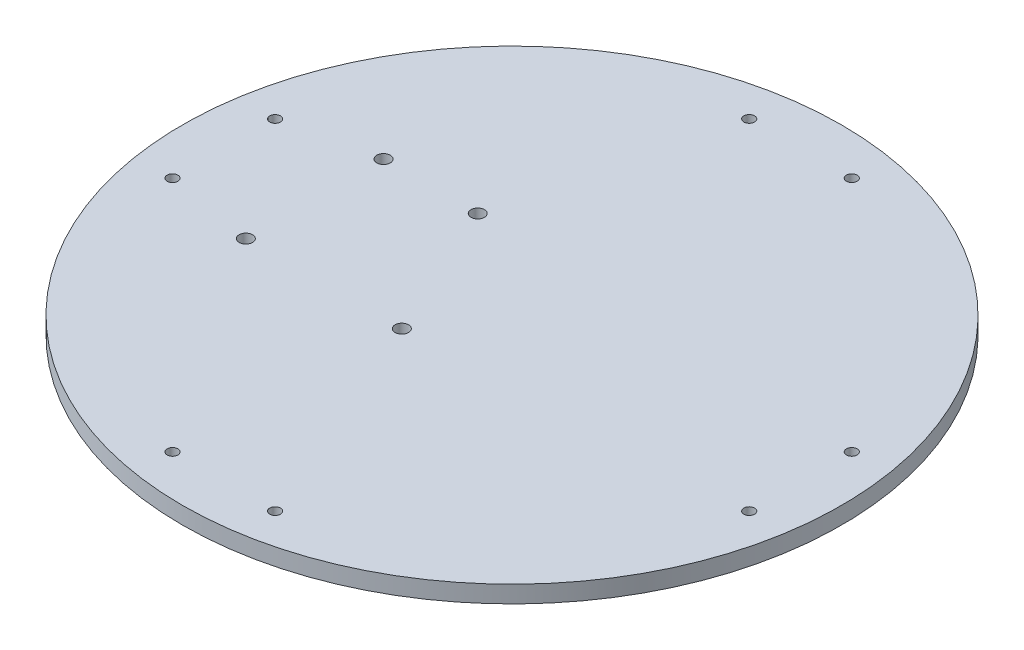
ISO-10303-21;
HEADER;
FILE_DESCRIPTION(('STEP AP214'),'2;1');
FILE_NAME('part.step','',(''),(''),'','','');
FILE_SCHEMA(('AUTOMOTIVE_DESIGN { 1 0 10303 214 1 1 1 1 }'));
ENDSEC;
DATA;
#1=APPLICATION_CONTEXT('core data for automotive mechanical design processes');
#2=APPLICATION_PROTOCOL_DEFINITION('international standard','automotive_design',2000,#1);
#3=PRODUCT_CONTEXT('',#1,'mechanical');
#4=PRODUCT('Part','Part','',(#3));
#5=PRODUCT_RELATED_PRODUCT_CATEGORY('part','',(#4));
#6=PRODUCT_DEFINITION_FORMATION('','',#4);
#7=PRODUCT_DEFINITION_CONTEXT('part definition',#1,'design');
#8=PRODUCT_DEFINITION('design','',#6,#7);
#9=PRODUCT_DEFINITION_SHAPE('','',#8);
#10=(LENGTH_UNIT() NAMED_UNIT(*) SI_UNIT(.MILLI.,.METRE.));
#11=(NAMED_UNIT(*) PLANE_ANGLE_UNIT() SI_UNIT($,.RADIAN.));
#12=(NAMED_UNIT(*) SI_UNIT($,.STERADIAN.) SOLID_ANGLE_UNIT());
#13=UNCERTAINTY_MEASURE_WITH_UNIT(LENGTH_MEASURE(1.E-05),#10,'distance_accuracy_value','');
#14=(GEOMETRIC_REPRESENTATION_CONTEXT(3) GLOBAL_UNCERTAINTY_ASSIGNED_CONTEXT((#13)) GLOBAL_UNIT_ASSIGNED_CONTEXT((#10,
#11,#12)) REPRESENTATION_CONTEXT('',''));
#15=CARTESIAN_POINT('',(0.,0.,0.));
#16=DIRECTION('',(0.,0.,1.));
#17=DIRECTION('',(1.,0.,0.));
#18=AXIS2_PLACEMENT_3D('',#15,#16,#17);
#19=CARTESIAN_POINT('',(0.,6.35,0.));
#20=DIRECTION('',(0.,-1.,0.));
#21=DIRECTION('',(0.,0.,-1.));
#22=AXIS2_PLACEMENT_3D('',#19,#20,#21);
#23=CYLINDRICAL_SURFACE('',#22,122.4);
#24=CARTESIAN_POINT('',(0.,6.35,0.));
#25=DIRECTION('',(0.,1.,0.));
#26=DIRECTION('',(0.,0.,1.));
#27=AXIS2_PLACEMENT_3D('',#24,#25,#26);
#28=CIRCLE('',#27,122.4);
#29=CARTESIAN_POINT('',(0.,6.35,122.4));
#30=VERTEX_POINT('',#29);
#31=EDGE_CURVE('E10',#30,#30,#28,.T.);
#32=ORIENTED_EDGE('',*,*,#31,.F.);
#33=EDGE_LOOP('',(#32));
#34=FACE_BOUND('',#33,.T.);
#35=CARTESIAN_POINT('',(0.,0.,0.));
#36=DIRECTION('',(0.,1.,0.));
#37=DIRECTION('',(0.,0.,1.));
#38=AXIS2_PLACEMENT_3D('',#35,#36,#37);
#39=CIRCLE('',#38,122.4);
#40=CARTESIAN_POINT('',(0.,0.,122.4));
#41=VERTEX_POINT('',#40);
#42=EDGE_CURVE('E34',#41,#41,#39,.T.);
#43=ORIENTED_EDGE('',*,*,#42,.T.);
#44=EDGE_LOOP('',(#43));
#45=FACE_BOUND('',#44,.T.);
#46=ADVANCED_FACE('F31',(#34,#45),#23,.T.);
#47=CARTESIAN_POINT('',(0.,6.35,0.));
#48=DIRECTION('',(0.,1.,0.));
#49=DIRECTION('',(0.,0.,1.));
#50=AXIS2_PLACEMENT_3D('',#47,#48,#49);
#51=PLANE('',#50);
#52=CARTESIAN_POINT('',(-74.0546317465637,6.35,24.8087490188917));
#53=DIRECTION('',(0.,1.,0.));
#54=DIRECTION('',(0.,0.,1.));
#55=AXIS2_PLACEMENT_3D('',#52,#53,#54);
#56=CIRCLE('',#55,2.5);
#57=CARTESIAN_POINT('',(-74.0546317465637,6.35,27.3087490188917));
#58=VERTEX_POINT('',#57);
#59=EDGE_CURVE('E97',#58,#58,#56,.T.);
#60=ORIENTED_EDGE('',*,*,#59,.F.);
#61=EDGE_LOOP('',(#60));
#62=FACE_BOUND('',#61,.T.);
#63=CARTESIAN_POINT('',(-16.1134368858091,6.35,24.8087490188917));
#64=DIRECTION('',(0.,1.,0.));
#65=DIRECTION('',(0.,0.,1.));
#66=AXIS2_PLACEMENT_3D('',#63,#64,#65);
#67=CIRCLE('',#66,2.5);
#68=CARTESIAN_POINT('',(-16.1134368858091,6.35,27.3087490188917));
#69=VERTEX_POINT('',#68);
#70=EDGE_CURVE('E103',#69,#69,#67,.T.);
#71=ORIENTED_EDGE('',*,*,#70,.F.);
#72=EDGE_LOOP('',(#71));
#73=FACE_BOUND('',#72,.T.);
#74=CARTESIAN_POINT('',(-39.0546317465637,6.35,-26.3358164106052));
#75=DIRECTION('',(0.,1.,0.));
#76=DIRECTION('',(0.,0.,1.));
#77=AXIS2_PLACEMENT_3D('',#74,#75,#76);
#78=CIRCLE('',#77,2.5);
#79=CARTESIAN_POINT('',(-39.0546317465637,6.35,-23.8358164106052));
#80=VERTEX_POINT('',#79);
#81=EDGE_CURVE('E109',#80,#80,#78,.T.);
#82=ORIENTED_EDGE('',*,*,#81,.F.);
#83=EDGE_LOOP('',(#82));
#84=FACE_BOUND('',#83,.T.);
#85=CARTESIAN_POINT('',(-74.0546317465637,6.35,-26.3358164106052));
#86=DIRECTION('',(0.,1.,0.));
#87=DIRECTION('',(0.,0.,1.));
#88=AXIS2_PLACEMENT_3D('',#85,#86,#87);
#89=CIRCLE('',#88,2.5);
#90=CARTESIAN_POINT('',(-74.0546317465637,6.35,-23.8358164106052));
#91=VERTEX_POINT('',#90);
#92=EDGE_CURVE('E91',#91,#91,#89,.T.);
#93=ORIENTED_EDGE('',*,*,#92,.F.);
#94=EDGE_LOOP('',(#93));
#95=FACE_BOUND('',#94,.T.);
#96=CARTESIAN_POINT('',(-107.09237909833,6.35,18.9931628263646));
#97=DIRECTION('',(0.,1.,0.));
#98=DIRECTION('',(-1.,0.,0.));
#99=AXIS2_PLACEMENT_3D('',#96,#97,#98);
#100=CIRCLE('',#99,1.99389999999999);
#101=CARTESIAN_POINT('',(-109.08627909833,6.35,18.9931628263646));
#102=VERTEX_POINT('',#101);
#103=EDGE_CURVE('E61',#102,#102,#100,.T.);
#104=ORIENTED_EDGE('',*,*,#103,.F.);
#105=EDGE_LOOP('',(#104));
#106=FACE_BOUND('',#105,.T.);
#107=CARTESIAN_POINT('',(-107.09237909833,6.35,-19.1068371736354));
#108=DIRECTION('',(0.,1.,0.));
#109=DIRECTION('',(-1.,0.,0.));
#110=AXIS2_PLACEMENT_3D('',#107,#108,#109);
#111=CIRCLE('',#110,1.99389999999999);
#112=CARTESIAN_POINT('',(-109.08627909833,6.35,-19.1068371736354));
#113=VERTEX_POINT('',#112);
#114=EDGE_CURVE('E68',#113,#113,#111,.T.);
#115=ORIENTED_EDGE('',*,*,#114,.F.);
#116=EDGE_LOOP('',(#115));
#117=FACE_BOUND('',#116,.T.);
#118=CARTESIAN_POINT('',(-19.05,6.35,-107.149216271966));
#119=DIRECTION('',(0.,1.,0.));
#120=DIRECTION('',(0.,0.,-1.));
#121=AXIS2_PLACEMENT_3D('',#118,#119,#120);
#122=CIRCLE('',#121,1.99389999999999);
#123=CARTESIAN_POINT('',(-19.05,6.35,-109.143116271966));
#124=VERTEX_POINT('',#123);
#125=EDGE_CURVE('E74',#124,#124,#122,.T.);
#126=ORIENTED_EDGE('',*,*,#125,.F.);
#127=EDGE_LOOP('',(#126));
#128=FACE_BOUND('',#127,.T.);
#129=CARTESIAN_POINT('',(19.05,6.35,-107.149216271966));
#130=DIRECTION('',(0.,1.,0.));
#131=DIRECTION('',(0.,0.,-1.));
#132=AXIS2_PLACEMENT_3D('',#129,#130,#131);
#133=CIRCLE('',#132,1.99389999999999);
#134=CARTESIAN_POINT('',(19.05,6.35,-109.143116271966));
#135=VERTEX_POINT('',#134);
#136=EDGE_CURVE('E80',#135,#135,#133,.T.);
#137=ORIENTED_EDGE('',*,*,#136,.F.);
#138=EDGE_LOOP('',(#137));
#139=FACE_BOUND('',#138,.T.);
#140=CARTESIAN_POINT('',(107.09237909833,6.35,-19.1068371736369));
#141=DIRECTION('',(0.,1.,0.));
#142=DIRECTION('',(1.,0.,0.));
#143=AXIS2_PLACEMENT_3D('',#140,#141,#142);
#144=CIRCLE('',#143,1.99389999999999);
#145=CARTESIAN_POINT('',(109.08627909833,6.35,-19.1068371736369));
#146=VERTEX_POINT('',#145);
#147=EDGE_CURVE('E86',#146,#146,#144,.T.);
#148=ORIENTED_EDGE('',*,*,#147,.F.);
#149=EDGE_LOOP('',(#148));
#150=FACE_BOUND('',#149,.T.);
#151=CARTESIAN_POINT('',(107.09237909833,6.35,18.9931628263631));
#152=DIRECTION('',(0.,1.,0.));
#153=DIRECTION('',(1.,0.,0.));
#154=AXIS2_PLACEMENT_3D('',#151,#152,#153);
#155=CIRCLE('',#154,1.99389999999999);
#156=CARTESIAN_POINT('',(109.08627909833,6.35,18.9931628263631));
#157=VERTEX_POINT('',#156);
#158=EDGE_CURVE('E55',#157,#157,#155,.T.);
#159=ORIENTED_EDGE('',*,*,#158,.F.);
#160=EDGE_LOOP('',(#159));
#161=FACE_BOUND('',#160,.T.);
#162=CARTESIAN_POINT('',(-19.05,6.35,107.035541924693));
#163=DIRECTION('',(0.,1.,0.));
#164=DIRECTION('',(0.,0.,1.));
#165=AXIS2_PLACEMENT_3D('',#162,#163,#164);
#166=CIRCLE('',#165,1.99389999999999);
#167=CARTESIAN_POINT('',(-19.05,6.35,109.029441924693));
#168=VERTEX_POINT('',#167);
#169=EDGE_CURVE('E50',#168,#168,#166,.T.);
#170=ORIENTED_EDGE('',*,*,#169,.F.);
#171=EDGE_LOOP('',(#170));
#172=FACE_BOUND('',#171,.T.);
#173=CARTESIAN_POINT('',(19.05,6.35,107.035541924693));
#174=DIRECTION('',(0.,1.,0.));
#175=DIRECTION('',(0.,0.,1.));
#176=AXIS2_PLACEMENT_3D('',#173,#174,#175);
#177=CIRCLE('',#176,1.99389999999999);
#178=CARTESIAN_POINT('',(19.05,6.35,109.029441924693));
#179=VERTEX_POINT('',#178);
#180=EDGE_CURVE('E43',#179,#179,#177,.T.);
#181=ORIENTED_EDGE('',*,*,#180,.F.);
#182=EDGE_LOOP('',(#181));
#183=FACE_BOUND('',#182,.T.);
#184=ORIENTED_EDGE('',*,*,#31,.T.);
#185=EDGE_LOOP('',(#184));
#186=FACE_BOUND('',#185,.T.);
#187=ADVANCED_FACE('F126',(#62,#73,#84,#95,#106,#117,#128,#139,#150,#161,#172,#183,#186),#51,.T.);
#188=CARTESIAN_POINT('',(0.,0.,0.));
#189=DIRECTION('',(0.,1.,0.));
#190=DIRECTION('',(0.,0.,1.));
#191=AXIS2_PLACEMENT_3D('',#188,#189,#190);
#192=PLANE('',#191);
#193=CARTESIAN_POINT('',(-74.0546317465637,0.,24.8087490188917));
#194=DIRECTION('',(0.,1.,0.));
#195=DIRECTION('',(0.,0.,1.));
#196=AXIS2_PLACEMENT_3D('',#193,#194,#195);
#197=CIRCLE('',#196,2.5);
#198=CARTESIAN_POINT('',(-74.0546317465637,0.,27.3087490188917));
#199=VERTEX_POINT('',#198);
#200=EDGE_CURVE('E100',#199,#199,#197,.T.);
#201=ORIENTED_EDGE('',*,*,#200,.T.);
#202=EDGE_LOOP('',(#201));
#203=FACE_BOUND('',#202,.T.);
#204=CARTESIAN_POINT('',(-16.1134368858091,0.,24.8087490188917));
#205=DIRECTION('',(0.,1.,0.));
#206=DIRECTION('',(0.,0.,1.));
#207=AXIS2_PLACEMENT_3D('',#204,#205,#206);
#208=CIRCLE('',#207,2.5);
#209=CARTESIAN_POINT('',(-16.1134368858091,0.,27.3087490188917));
#210=VERTEX_POINT('',#209);
#211=EDGE_CURVE('E106',#210,#210,#208,.T.);
#212=ORIENTED_EDGE('',*,*,#211,.T.);
#213=EDGE_LOOP('',(#212));
#214=FACE_BOUND('',#213,.T.);
#215=CARTESIAN_POINT('',(-39.0546317465637,0.,-26.3358164106052));
#216=DIRECTION('',(0.,1.,0.));
#217=DIRECTION('',(0.,0.,1.));
#218=AXIS2_PLACEMENT_3D('',#215,#216,#217);
#219=CIRCLE('',#218,2.5);
#220=CARTESIAN_POINT('',(-39.0546317465637,0.,-23.8358164106052));
#221=VERTEX_POINT('',#220);
#222=EDGE_CURVE('E94',#221,#221,#219,.T.);
#223=ORIENTED_EDGE('',*,*,#222,.T.);
#224=EDGE_LOOP('',(#223));
#225=FACE_BOUND('',#224,.T.);
#226=CARTESIAN_POINT('',(-74.0546317465637,0.,-26.3358164106052));
#227=DIRECTION('',(0.,1.,0.));
#228=DIRECTION('',(0.,0.,1.));
#229=AXIS2_PLACEMENT_3D('',#226,#227,#228);
#230=CIRCLE('',#229,2.5);
#231=CARTESIAN_POINT('',(-74.0546317465637,0.,-23.8358164106052));
#232=VERTEX_POINT('',#231);
#233=EDGE_CURVE('E65',#232,#232,#230,.T.);
#234=ORIENTED_EDGE('',*,*,#233,.T.);
#235=EDGE_LOOP('',(#234));
#236=FACE_BOUND('',#235,.T.);
#237=CARTESIAN_POINT('',(-107.09237909833,0.,18.9931628263646));
#238=DIRECTION('',(0.,1.,0.));
#239=DIRECTION('',(-1.,0.,0.));
#240=AXIS2_PLACEMENT_3D('',#237,#238,#239);
#241=CIRCLE('',#240,1.99389999999999);
#242=CARTESIAN_POINT('',(-109.08627909833,0.,18.9931628263646));
#243=VERTEX_POINT('',#242);
#244=EDGE_CURVE('E64',#243,#243,#241,.T.);
#245=ORIENTED_EDGE('',*,*,#244,.T.);
#246=EDGE_LOOP('',(#245));
#247=FACE_BOUND('',#246,.T.);
#248=CARTESIAN_POINT('',(-107.09237909833,0.,-19.1068371736354));
#249=DIRECTION('',(0.,1.,0.));
#250=DIRECTION('',(-1.,0.,0.));
#251=AXIS2_PLACEMENT_3D('',#248,#249,#250);
#252=CIRCLE('',#251,1.99389999999999);
#253=CARTESIAN_POINT('',(-109.08627909833,0.,-19.1068371736354));
#254=VERTEX_POINT('',#253);
#255=EDGE_CURVE('E71',#254,#254,#252,.T.);
#256=ORIENTED_EDGE('',*,*,#255,.T.);
#257=EDGE_LOOP('',(#256));
#258=FACE_BOUND('',#257,.T.);
#259=CARTESIAN_POINT('',(-19.05,0.,-107.149216271966));
#260=DIRECTION('',(0.,1.,0.));
#261=DIRECTION('',(0.,0.,-1.));
#262=AXIS2_PLACEMENT_3D('',#259,#260,#261);
#263=CIRCLE('',#262,1.99389999999999);
#264=CARTESIAN_POINT('',(-19.05,0.,-109.143116271966));
#265=VERTEX_POINT('',#264);
#266=EDGE_CURVE('E77',#265,#265,#263,.T.);
#267=ORIENTED_EDGE('',*,*,#266,.T.);
#268=EDGE_LOOP('',(#267));
#269=FACE_BOUND('',#268,.T.);
#270=CARTESIAN_POINT('',(19.05,0.,-107.149216271966));
#271=DIRECTION('',(0.,1.,0.));
#272=DIRECTION('',(0.,0.,-1.));
#273=AXIS2_PLACEMENT_3D('',#270,#271,#272);
#274=CIRCLE('',#273,1.99389999999999);
#275=CARTESIAN_POINT('',(19.05,0.,-109.143116271966));
#276=VERTEX_POINT('',#275);
#277=EDGE_CURVE('E83',#276,#276,#274,.T.);
#278=ORIENTED_EDGE('',*,*,#277,.T.);
#279=EDGE_LOOP('',(#278));
#280=FACE_BOUND('',#279,.T.);
#281=CARTESIAN_POINT('',(107.09237909833,0.,-19.1068371736369));
#282=DIRECTION('',(0.,1.,0.));
#283=DIRECTION('',(1.,0.,0.));
#284=AXIS2_PLACEMENT_3D('',#281,#282,#283);
#285=CIRCLE('',#284,1.99389999999999);
#286=CARTESIAN_POINT('',(109.08627909833,0.,-19.1068371736369));
#287=VERTEX_POINT('',#286);
#288=EDGE_CURVE('E58',#287,#287,#285,.T.);
#289=ORIENTED_EDGE('',*,*,#288,.T.);
#290=EDGE_LOOP('',(#289));
#291=FACE_BOUND('',#290,.T.);
#292=CARTESIAN_POINT('',(107.09237909833,0.,18.9931628263631));
#293=DIRECTION('',(0.,1.,0.));
#294=DIRECTION('',(1.,0.,0.));
#295=AXIS2_PLACEMENT_3D('',#292,#293,#294);
#296=CIRCLE('',#295,1.99389999999999);
#297=CARTESIAN_POINT('',(109.08627909833,0.,18.9931628263631));
#298=VERTEX_POINT('',#297);
#299=EDGE_CURVE('E47',#298,#298,#296,.T.);
#300=ORIENTED_EDGE('',*,*,#299,.T.);
#301=EDGE_LOOP('',(#300));
#302=FACE_BOUND('',#301,.T.);
#303=CARTESIAN_POINT('',(-19.05,0.,107.035541924693));
#304=DIRECTION('',(0.,1.,0.));
#305=DIRECTION('',(0.,0.,1.));
#306=AXIS2_PLACEMENT_3D('',#303,#304,#305);
#307=CIRCLE('',#306,1.99389999999999);
#308=CARTESIAN_POINT('',(-19.05,0.,109.029441924693));
#309=VERTEX_POINT('',#308);
#310=EDGE_CURVE('E41',#309,#309,#307,.T.);
#311=ORIENTED_EDGE('',*,*,#310,.T.);
#312=EDGE_LOOP('',(#311));
#313=FACE_BOUND('',#312,.T.);
#314=CARTESIAN_POINT('',(19.05,0.,107.035541924693));
#315=DIRECTION('',(0.,1.,0.));
#316=DIRECTION('',(0.,0.,1.));
#317=AXIS2_PLACEMENT_3D('',#314,#315,#316);
#318=CIRCLE('',#317,1.99389999999999);
#319=CARTESIAN_POINT('',(19.05,0.,109.029441924693));
#320=VERTEX_POINT('',#319);
#321=EDGE_CURVE('E46',#320,#320,#318,.T.);
#322=ORIENTED_EDGE('',*,*,#321,.T.);
#323=EDGE_LOOP('',(#322));
#324=FACE_BOUND('',#323,.T.);
#325=ORIENTED_EDGE('',*,*,#42,.F.);
#326=EDGE_LOOP('',(#325));
#327=FACE_BOUND('',#326,.T.);
#328=ADVANCED_FACE('F115',(#203,#214,#225,#236,#247,#258,#269,#280,#291,#302,#313,#324,#327),
#192,.F.);
#329=CARTESIAN_POINT('',(19.05,0.,107.035541924693));
#330=DIRECTION('',(0.,1.,0.));
#331=DIRECTION('',(0.,0.,1.));
#332=AXIS2_PLACEMENT_3D('',#329,#330,#331);
#333=CYLINDRICAL_SURFACE('',#332,1.99389999999999);
#334=ORIENTED_EDGE('',*,*,#321,.F.);
#335=EDGE_LOOP('',(#334));
#336=FACE_BOUND('',#335,.T.);
#337=ORIENTED_EDGE('',*,*,#180,.T.);
#338=EDGE_LOOP('',(#337));
#339=FACE_BOUND('',#338,.T.);
#340=ADVANCED_FACE('F149',(#336,#339),#333,.F.);
#341=CARTESIAN_POINT('',(-19.05,0.,107.035541924693));
#342=DIRECTION('',(0.,1.,0.));
#343=DIRECTION('',(0.,0.,1.));
#344=AXIS2_PLACEMENT_3D('',#341,#342,#343);
#345=CYLINDRICAL_SURFACE('',#344,1.99389999999999);
#346=ORIENTED_EDGE('',*,*,#310,.F.);
#347=EDGE_LOOP('',(#346));
#348=FACE_BOUND('',#347,.T.);
#349=ORIENTED_EDGE('',*,*,#169,.T.);
#350=EDGE_LOOP('',(#349));
#351=FACE_BOUND('',#350,.T.);
#352=ADVANCED_FACE('F151',(#348,#351),#345,.F.);
#353=CARTESIAN_POINT('',(107.09237909833,0.,18.9931628263631));
#354=DIRECTION('',(0.,1.,0.));
#355=DIRECTION('',(0.,0.,1.));
#356=AXIS2_PLACEMENT_3D('',#353,#354,#355);
#357=CYLINDRICAL_SURFACE('',#356,1.99389999999999);
#358=ORIENTED_EDGE('',*,*,#299,.F.);
#359=EDGE_LOOP('',(#358));
#360=FACE_BOUND('',#359,.T.);
#361=ORIENTED_EDGE('',*,*,#158,.T.);
#362=EDGE_LOOP('',(#361));
#363=FACE_BOUND('',#362,.T.);
#364=ADVANCED_FACE('F158',(#360,#363),#357,.F.);
#365=CARTESIAN_POINT('',(107.09237909833,0.,-19.1068371736369));
#366=DIRECTION('',(0.,1.,0.));
#367=DIRECTION('',(0.,0.,1.));
#368=AXIS2_PLACEMENT_3D('',#365,#366,#367);
#369=CYLINDRICAL_SURFACE('',#368,1.99389999999999);
#370=ORIENTED_EDGE('',*,*,#288,.F.);
#371=EDGE_LOOP('',(#370));
#372=FACE_BOUND('',#371,.T.);
#373=ORIENTED_EDGE('',*,*,#147,.T.);
#374=EDGE_LOOP('',(#373));
#375=FACE_BOUND('',#374,.T.);
#376=ADVANCED_FACE('F226',(#372,#375),#369,.F.);
#377=CARTESIAN_POINT('',(19.05,0.,-107.149216271966));
#378=DIRECTION('',(0.,1.,0.));
#379=DIRECTION('',(0.,0.,1.));
#380=AXIS2_PLACEMENT_3D('',#377,#378,#379);
#381=CYLINDRICAL_SURFACE('',#380,1.99389999999999);
#382=ORIENTED_EDGE('',*,*,#277,.F.);
#383=EDGE_LOOP('',(#382));
#384=FACE_BOUND('',#383,.T.);
#385=ORIENTED_EDGE('',*,*,#136,.T.);
#386=EDGE_LOOP('',(#385));
#387=FACE_BOUND('',#386,.T.);
#388=ADVANCED_FACE('F229',(#384,#387),#381,.F.);
#389=CARTESIAN_POINT('',(-19.05,0.,-107.149216271966));
#390=DIRECTION('',(0.,1.,0.));
#391=DIRECTION('',(0.,0.,1.));
#392=AXIS2_PLACEMENT_3D('',#389,#390,#391);
#393=CYLINDRICAL_SURFACE('',#392,1.99389999999999);
#394=ORIENTED_EDGE('',*,*,#266,.F.);
#395=EDGE_LOOP('',(#394));
#396=FACE_BOUND('',#395,.T.);
#397=ORIENTED_EDGE('',*,*,#125,.T.);
#398=EDGE_LOOP('',(#397));
#399=FACE_BOUND('',#398,.T.);
#400=ADVANCED_FACE('F233',(#396,#399),#393,.F.);
#401=CARTESIAN_POINT('',(-107.09237909833,0.,-19.1068371736354));
#402=DIRECTION('',(0.,1.,0.));
#403=DIRECTION('',(0.,0.,1.));
#404=AXIS2_PLACEMENT_3D('',#401,#402,#403);
#405=CYLINDRICAL_SURFACE('',#404,1.99389999999999);
#406=ORIENTED_EDGE('',*,*,#255,.F.);
#407=EDGE_LOOP('',(#406));
#408=FACE_BOUND('',#407,.T.);
#409=ORIENTED_EDGE('',*,*,#114,.T.);
#410=EDGE_LOOP('',(#409));
#411=FACE_BOUND('',#410,.T.);
#412=ADVANCED_FACE('F237',(#408,#411),#405,.F.);
#413=CARTESIAN_POINT('',(-107.09237909833,0.,18.9931628263646));
#414=DIRECTION('',(0.,1.,0.));
#415=DIRECTION('',(0.,0.,1.));
#416=AXIS2_PLACEMENT_3D('',#413,#414,#415);
#417=CYLINDRICAL_SURFACE('',#416,1.99389999999999);
#418=ORIENTED_EDGE('',*,*,#244,.F.);
#419=EDGE_LOOP('',(#418));
#420=FACE_BOUND('',#419,.T.);
#421=ORIENTED_EDGE('',*,*,#103,.T.);
#422=EDGE_LOOP('',(#421));
#423=FACE_BOUND('',#422,.T.);
#424=ADVANCED_FACE('F191',(#420,#423),#417,.F.);
#425=CARTESIAN_POINT('',(-74.0546317465637,0.,-26.3358164106052));
#426=DIRECTION('',(0.,1.,0.));
#427=DIRECTION('',(0.,0.,1.));
#428=AXIS2_PLACEMENT_3D('',#425,#426,#427);
#429=CYLINDRICAL_SURFACE('',#428,2.5);
#430=ORIENTED_EDGE('',*,*,#233,.F.);
#431=EDGE_LOOP('',(#430));
#432=FACE_BOUND('',#431,.T.);
#433=ORIENTED_EDGE('',*,*,#92,.T.);
#434=EDGE_LOOP('',(#433));
#435=FACE_BOUND('',#434,.T.);
#436=ADVANCED_FACE('F122',(#432,#435),#429,.F.);
#437=CARTESIAN_POINT('',(-39.0546317465637,0.,-26.3358164106052));
#438=DIRECTION('',(0.,1.,0.));
#439=DIRECTION('',(0.,0.,1.));
#440=AXIS2_PLACEMENT_3D('',#437,#438,#439);
#441=CYLINDRICAL_SURFACE('',#440,2.5);
#442=ORIENTED_EDGE('',*,*,#222,.F.);
#443=EDGE_LOOP('',(#442));
#444=FACE_BOUND('',#443,.T.);
#445=ORIENTED_EDGE('',*,*,#81,.T.);
#446=EDGE_LOOP('',(#445));
#447=FACE_BOUND('',#446,.T.);
#448=ADVANCED_FACE('F118',(#444,#447),#441,.F.);
#449=CARTESIAN_POINT('',(-16.1134368858091,0.,24.8087490188917));
#450=DIRECTION('',(0.,1.,0.));
#451=DIRECTION('',(0.,0.,1.));
#452=AXIS2_PLACEMENT_3D('',#449,#450,#451);
#453=CYLINDRICAL_SURFACE('',#452,2.5);
#454=ORIENTED_EDGE('',*,*,#211,.F.);
#455=EDGE_LOOP('',(#454));
#456=FACE_BOUND('',#455,.T.);
#457=ORIENTED_EDGE('',*,*,#70,.T.);
#458=EDGE_LOOP('',(#457));
#459=FACE_BOUND('',#458,.T.);
#460=ADVANCED_FACE('F121',(#456,#459),#453,.F.);
#461=CARTESIAN_POINT('',(-74.0546317465637,0.,24.8087490188917));
#462=DIRECTION('',(0.,1.,0.));
#463=DIRECTION('',(0.,0.,1.));
#464=AXIS2_PLACEMENT_3D('',#461,#462,#463);
#465=CYLINDRICAL_SURFACE('',#464,2.5);
#466=ORIENTED_EDGE('',*,*,#200,.F.);
#467=EDGE_LOOP('',(#466));
#468=FACE_BOUND('',#467,.T.);
#469=ORIENTED_EDGE('',*,*,#59,.T.);
#470=EDGE_LOOP('',(#469));
#471=FACE_BOUND('',#470,.T.);
#472=ADVANCED_FACE('F209',(#468,#471),#465,.F.);
#473=CLOSED_SHELL('',(#46,#187,#328,#340,#352,#364,#376,#388,#400,#412,#424,#436,#448,#460,#472));
#474=MANIFOLD_SOLID_BREP('B2',#473);
#475=ADVANCED_BREP_SHAPE_REPRESENTATION('',(#18,#474),#14);
#476=SHAPE_DEFINITION_REPRESENTATION(#9,#475);
ENDSEC;
END-ISO-10303-21;
